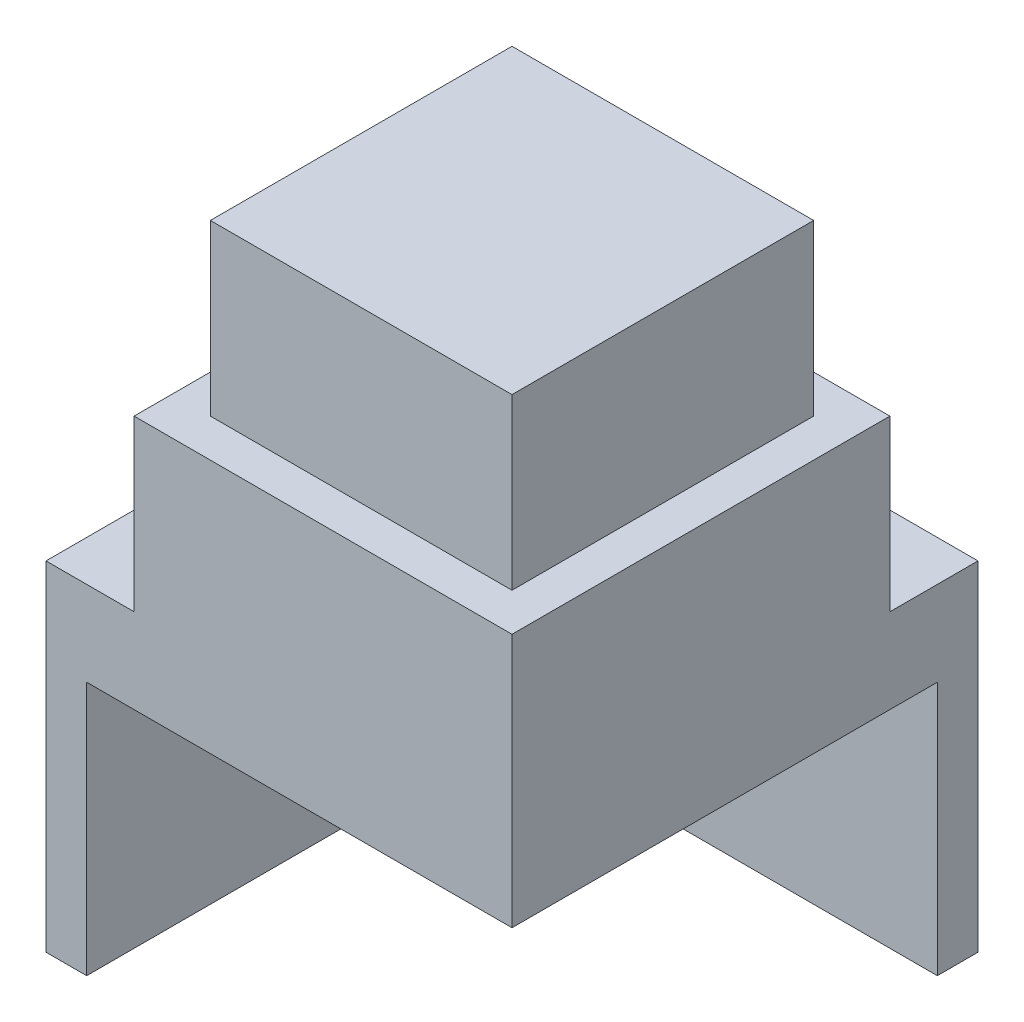
ISO-10303-21;
HEADER;
FILE_DESCRIPTION(('STEP AP214'),'2;1');
FILE_NAME('part.step','',(''),(''),'','','');
FILE_SCHEMA(('AUTOMOTIVE_DESIGN { 1 0 10303 214 1 1 1 1 }'));
ENDSEC;
DATA;
#1=APPLICATION_CONTEXT('core data for automotive mechanical design processes');
#2=APPLICATION_PROTOCOL_DEFINITION('international standard','automotive_design',2000,#1);
#3=PRODUCT_CONTEXT('',#1,'mechanical');
#4=PRODUCT('Part','Part','',(#3));
#5=PRODUCT_RELATED_PRODUCT_CATEGORY('part','',(#4));
#6=PRODUCT_DEFINITION_FORMATION('','',#4);
#7=PRODUCT_DEFINITION_CONTEXT('part definition',#1,'design');
#8=PRODUCT_DEFINITION('design','',#6,#7);
#9=PRODUCT_DEFINITION_SHAPE('','',#8);
#10=(LENGTH_UNIT() NAMED_UNIT(*) SI_UNIT(.MILLI.,.METRE.));
#11=(NAMED_UNIT(*) PLANE_ANGLE_UNIT() SI_UNIT($,.RADIAN.));
#12=(NAMED_UNIT(*) SI_UNIT($,.STERADIAN.) SOLID_ANGLE_UNIT());
#13=UNCERTAINTY_MEASURE_WITH_UNIT(LENGTH_MEASURE(1.E-05),#10,'distance_accuracy_value','');
#14=(GEOMETRIC_REPRESENTATION_CONTEXT(3) GLOBAL_UNCERTAINTY_ASSIGNED_CONTEXT((#13)) GLOBAL_UNIT_ASSIGNED_CONTEXT((#10,
#11,#12)) REPRESENTATION_CONTEXT('',''));
#15=CARTESIAN_POINT('',(0.,0.,0.));
#16=DIRECTION('',(0.,0.,1.));
#17=DIRECTION('',(1.,0.,0.));
#18=AXIS2_PLACEMENT_3D('',#15,#16,#17);
#19=CARTESIAN_POINT('',(13.75,15.,-13.75));
#20=DIRECTION('',(-1.,0.,0.));
#21=DIRECTION('',(0.,0.,1.));
#22=AXIS2_PLACEMENT_3D('',#19,#20,#21);
#23=PLANE('',#22);
#24=DIRECTION('',(0.,1.,0.));
#25=VECTOR('',#24,1.);
#26=CARTESIAN_POINT('',(13.75,5.,-8.55000000000001));
#27=LINE('',#26,#25);
#28=CARTESIAN_POINT('',(13.75,5.,-8.55000000000001));
#29=VERTEX_POINT('',#28);
#30=CARTESIAN_POINT('',(13.75,15.,-8.55000000000001));
#31=VERTEX_POINT('',#30);
#32=EDGE_CURVE('E228',#29,#31,#27,.T.);
#33=ORIENTED_EDGE('',*,*,#32,.T.);
#34=DIRECTION('',(0.,0.,-1.));
#35=VECTOR('',#34,1.);
#36=CARTESIAN_POINT('',(13.75,15.,-13.75));
#37=LINE('',#36,#35);
#38=CARTESIAN_POINT('',(13.75,15.,13.75));
#39=VERTEX_POINT('',#38);
#40=EDGE_CURVE('E235',#39,#31,#37,.T.);
#41=ORIENTED_EDGE('',*,*,#40,.F.);
#42=DIRECTION('',(0.,-1.,0.));
#43=VECTOR('',#42,1.);
#44=CARTESIAN_POINT('',(13.75,15.,13.75));
#45=LINE('',#44,#43);
#46=CARTESIAN_POINT('',(13.75,0.,13.75));
#47=VERTEX_POINT('',#46);
#48=EDGE_CURVE('E240',#39,#47,#45,.T.);
#49=ORIENTED_EDGE('',*,*,#48,.T.);
#50=DIRECTION('',(0.,0.,-1.));
#51=VECTOR('',#50,1.);
#52=CARTESIAN_POINT('',(13.75,0.,-13.75));
#53=LINE('',#52,#51);
#54=CARTESIAN_POINT('',(13.75,0.,-11.35));
#55=VERTEX_POINT('',#54);
#56=EDGE_CURVE('E231',#47,#55,#53,.T.);
#57=ORIENTED_EDGE('',*,*,#56,.T.);
#58=DIRECTION('',(0.,1.,0.));
#59=VECTOR('',#58,1.);
#60=CARTESIAN_POINT('',(13.75,-15.,-11.35));
#61=LINE('',#60,#59);
#62=CARTESIAN_POINT('',(13.75,-15.,-11.35));
#63=VERTEX_POINT('',#62);
#64=EDGE_CURVE('E142',#63,#55,#61,.T.);
#65=ORIENTED_EDGE('',*,*,#64,.F.);
#66=DIRECTION('',(0.,0.,1.));
#67=VECTOR('',#66,1.);
#68=CARTESIAN_POINT('',(13.75,-15.,0.));
#69=LINE('',#68,#67);
#70=CARTESIAN_POINT('',(13.75,-15.,-13.75));
#71=VERTEX_POINT('',#70);
#72=EDGE_CURVE('E167',#71,#63,#69,.T.);
#73=ORIENTED_EDGE('',*,*,#72,.F.);
#74=DIRECTION('',(0.,-1.,0.));
#75=VECTOR('',#74,1.);
#76=CARTESIAN_POINT('',(13.75,15.,-13.75));
#77=LINE('',#76,#75);
#78=CARTESIAN_POINT('',(13.75,5.,-13.75));
#79=VERTEX_POINT('',#78);
#80=EDGE_CURVE('E11',#79,#71,#77,.T.);
#81=ORIENTED_EDGE('',*,*,#80,.F.);
#82=DIRECTION('',(0.,0.,-1.));
#83=VECTOR('',#82,1.);
#84=CARTESIAN_POINT('',(13.75,5.,0.));
#85=LINE('',#84,#83);
#86=EDGE_CURVE('E217',#29,#79,#85,.T.);
#87=ORIENTED_EDGE('',*,*,#86,.F.);
#88=EDGE_LOOP('',(#33,#41,#49,#57,#65,#73,#81,#87));
#89=FACE_BOUND('',#88,.T.);
#90=ADVANCED_FACE('F35',(#89),#23,.F.);
#91=CARTESIAN_POINT('',(-13.75,15.,-13.75));
#92=DIRECTION('',(0.,0.,1.));
#93=DIRECTION('',(1.,0.,0.));
#94=AXIS2_PLACEMENT_3D('',#91,#92,#93);
#95=PLANE('',#94);
#96=DIRECTION('',(-1.,0.,0.));
#97=VECTOR('',#96,1.);
#98=CARTESIAN_POINT('',(0.,5.,-13.75));
#99=LINE('',#98,#97);
#100=CARTESIAN_POINT('',(-13.75,5.,-13.75));
#101=VERTEX_POINT('',#100);
#102=EDGE_CURVE('E219',#79,#101,#99,.T.);
#103=ORIENTED_EDGE('',*,*,#102,.F.);
#104=ORIENTED_EDGE('',*,*,#80,.T.);
#105=DIRECTION('',(1.,0.,0.));
#106=VECTOR('',#105,1.);
#107=CARTESIAN_POINT('',(0.,-15.,-13.75));
#108=LINE('',#107,#106);
#109=CARTESIAN_POINT('',(-13.75,-15.,-13.75));
#110=VERTEX_POINT('',#109);
#111=EDGE_CURVE('E164',#110,#71,#108,.T.);
#112=ORIENTED_EDGE('',*,*,#111,.F.);
#113=DIRECTION('',(0.,-1.,0.));
#114=VECTOR('',#113,1.);
#115=CARTESIAN_POINT('',(-13.75,15.,-13.75));
#116=LINE('',#115,#114);
#117=EDGE_CURVE('E42',#101,#110,#116,.T.);
#118=ORIENTED_EDGE('',*,*,#117,.F.);
#119=EDGE_LOOP('',(#103,#104,#112,#118));
#120=FACE_BOUND('',#119,.T.);
#121=ADVANCED_FACE('F253',(#120),#95,.F.);
#122=CARTESIAN_POINT('',(-13.75,15.,-13.75));
#123=DIRECTION('',(1.,0.,0.));
#124=DIRECTION('',(0.,0.,-1.));
#125=AXIS2_PLACEMENT_3D('',#122,#123,#124);
#126=PLANE('',#125);
#127=DIRECTION('',(0.,0.,1.));
#128=VECTOR('',#127,1.);
#129=CARTESIAN_POINT('',(-13.75,5.,0.));
#130=LINE('',#129,#128);
#131=CARTESIAN_POINT('',(-13.75,5.,13.75));
#132=VERTEX_POINT('',#131);
#133=EDGE_CURVE('E221',#101,#132,#130,.T.);
#134=ORIENTED_EDGE('',*,*,#133,.F.);
#135=ORIENTED_EDGE('',*,*,#117,.T.);
#136=DIRECTION('',(0.,0.,-1.));
#137=VECTOR('',#136,1.);
#138=CARTESIAN_POINT('',(-13.75,-15.,0.));
#139=LINE('',#138,#137);
#140=CARTESIAN_POINT('',(-13.75,-15.,13.75));
#141=VERTEX_POINT('',#140);
#142=EDGE_CURVE('E154',#141,#110,#139,.T.);
#143=ORIENTED_EDGE('',*,*,#142,.F.);
#144=DIRECTION('',(0.,-1.,0.));
#145=VECTOR('',#144,1.);
#146=CARTESIAN_POINT('',(-13.75,15.,13.75));
#147=LINE('',#146,#145);
#148=EDGE_CURVE('E150',#132,#141,#147,.T.);
#149=ORIENTED_EDGE('',*,*,#148,.F.);
#150=EDGE_LOOP('',(#134,#135,#143,#149));
#151=FACE_BOUND('',#150,.T.);
#152=ADVANCED_FACE('F248',(#151),#126,.F.);
#153=CARTESIAN_POINT('',(0.,15.,0.));
#154=DIRECTION('',(0.,1.,0.));
#155=DIRECTION('',(0.,0.,1.));
#156=AXIS2_PLACEMENT_3D('',#153,#154,#155);
#157=PLANE('',#156);
#158=DIRECTION('',(0.,0.,-1.));
#159=VECTOR('',#158,1.);
#160=CARTESIAN_POINT('',(11.5,15.,-6.30000000000001));
#161=LINE('',#160,#159);
#162=CARTESIAN_POINT('',(11.5,15.,11.5));
#163=VERTEX_POINT('',#162);
#164=CARTESIAN_POINT('',(11.5,15.,-6.30000000000001));
#165=VERTEX_POINT('',#164);
#166=EDGE_CURVE('E141',#163,#165,#161,.T.);
#167=ORIENTED_EDGE('',*,*,#166,.F.);
#168=DIRECTION('',(1.,0.,0.));
#169=VECTOR('',#168,1.);
#170=CARTESIAN_POINT('',(-6.29999999999999,15.,11.5));
#171=LINE('',#170,#169);
#172=CARTESIAN_POINT('',(-6.29999999999999,15.,11.5));
#173=VERTEX_POINT('',#172);
#174=EDGE_CURVE('E179',#173,#163,#171,.T.);
#175=ORIENTED_EDGE('',*,*,#174,.F.);
#176=DIRECTION('',(0.,0.,1.));
#177=VECTOR('',#176,1.);
#178=CARTESIAN_POINT('',(-6.3,15.,-6.30000000000001));
#179=LINE('',#178,#177);
#180=CARTESIAN_POINT('',(-6.3,15.,-6.30000000000001));
#181=VERTEX_POINT('',#180);
#182=EDGE_CURVE('E191',#181,#173,#179,.T.);
#183=ORIENTED_EDGE('',*,*,#182,.F.);
#184=DIRECTION('',(-1.,0.,0.));
#185=VECTOR('',#184,1.);
#186=CARTESIAN_POINT('',(-6.3,15.,-6.30000000000001));
#187=LINE('',#186,#185);
#188=EDGE_CURVE('E188',#165,#181,#187,.T.);
#189=ORIENTED_EDGE('',*,*,#188,.F.);
#190=EDGE_LOOP('',(#167,#175,#183,#189));
#191=FACE_BOUND('',#190,.T.);
#192=ORIENTED_EDGE('',*,*,#40,.T.);
#193=DIRECTION('',(-1.,0.,0.));
#194=VECTOR('',#193,1.);
#195=CARTESIAN_POINT('',(0.,15.,-8.55));
#196=LINE('',#195,#194);
#197=CARTESIAN_POINT('',(-8.55,15.,-8.55));
#198=VERTEX_POINT('',#197);
#199=EDGE_CURVE('E212',#31,#198,#196,.T.);
#200=ORIENTED_EDGE('',*,*,#199,.T.);
#201=DIRECTION('',(0.,0.,-1.));
#202=VECTOR('',#201,1.);
#203=CARTESIAN_POINT('',(-8.55,15.,0.));
#204=LINE('',#203,#202);
#205=CARTESIAN_POINT('',(-8.55,15.,13.75));
#206=VERTEX_POINT('',#205);
#207=EDGE_CURVE('E207',#206,#198,#204,.T.);
#208=ORIENTED_EDGE('',*,*,#207,.F.);
#209=DIRECTION('',(1.,0.,0.));
#210=VECTOR('',#209,1.);
#211=CARTESIAN_POINT('',(-13.75,15.,13.75));
#212=LINE('',#211,#210);
#213=EDGE_CURVE('E238',#206,#39,#212,.T.);
#214=ORIENTED_EDGE('',*,*,#213,.T.);
#215=EDGE_LOOP('',(#192,#200,#208,#214));
#216=FACE_BOUND('',#215,.T.);
#217=ADVANCED_FACE('F276',(#191,#216),#157,.T.);
#218=CARTESIAN_POINT('',(-13.75,15.,13.75));
#219=DIRECTION('',(0.,0.,-1.));
#220=DIRECTION('',(-1.,0.,0.));
#221=AXIS2_PLACEMENT_3D('',#218,#219,#220);
#222=PLANE('',#221);
#223=ORIENTED_EDGE('',*,*,#213,.F.);
#224=DIRECTION('',(0.,1.,0.));
#225=VECTOR('',#224,1.);
#226=CARTESIAN_POINT('',(-8.55,5.,13.75));
#227=LINE('',#226,#225);
#228=CARTESIAN_POINT('',(-8.55,5.,13.75));
#229=VERTEX_POINT('',#228);
#230=EDGE_CURVE('E223',#229,#206,#227,.T.);
#231=ORIENTED_EDGE('',*,*,#230,.F.);
#232=DIRECTION('',(1.,0.,0.));
#233=VECTOR('',#232,1.);
#234=CARTESIAN_POINT('',(0.,5.,13.75));
#235=LINE('',#234,#233);
#236=EDGE_CURVE('E208',#132,#229,#235,.T.);
#237=ORIENTED_EDGE('',*,*,#236,.F.);
#238=ORIENTED_EDGE('',*,*,#148,.T.);
#239=DIRECTION('',(-1.,0.,0.));
#240=VECTOR('',#239,1.);
#241=CARTESIAN_POINT('',(0.,-15.,13.75));
#242=LINE('',#241,#240);
#243=CARTESIAN_POINT('',(-11.35,-15.,13.75));
#244=VERTEX_POINT('',#243);
#245=EDGE_CURVE('E145',#244,#141,#242,.T.);
#246=ORIENTED_EDGE('',*,*,#245,.F.);
#247=DIRECTION('',(0.,1.,0.));
#248=VECTOR('',#247,1.);
#249=CARTESIAN_POINT('',(-11.35,-15.,13.75));
#250=LINE('',#249,#248);
#251=CARTESIAN_POINT('',(-11.35,0.,13.75));
#252=VERTEX_POINT('',#251);
#253=EDGE_CURVE('E133',#244,#252,#250,.T.);
#254=ORIENTED_EDGE('',*,*,#253,.T.);
#255=DIRECTION('',(1.,0.,0.));
#256=VECTOR('',#255,1.);
#257=CARTESIAN_POINT('',(-13.75,0.,13.75));
#258=LINE('',#257,#256);
#259=EDGE_CURVE('E49',#252,#47,#258,.T.);
#260=ORIENTED_EDGE('',*,*,#259,.T.);
#261=ORIENTED_EDGE('',*,*,#48,.F.);
#262=EDGE_LOOP('',(#223,#231,#237,#238,#246,#254,#260,#261));
#263=FACE_BOUND('',#262,.T.);
#264=ADVANCED_FACE('F147',(#263),#222,.F.);
#265=CARTESIAN_POINT('',(0.,0.,0.));
#266=DIRECTION('',(0.,1.,0.));
#267=DIRECTION('',(0.,0.,1.));
#268=AXIS2_PLACEMENT_3D('',#265,#266,#267);
#269=PLANE('',#268);
#270=ORIENTED_EDGE('',*,*,#259,.F.);
#271=DIRECTION('',(0.,0.,-1.));
#272=VECTOR('',#271,1.);
#273=CARTESIAN_POINT('',(-11.35,0.,0.));
#274=LINE('',#273,#272);
#275=CARTESIAN_POINT('',(-11.35,0.,-11.35));
#276=VERTEX_POINT('',#275);
#277=EDGE_CURVE('E139',#252,#276,#274,.T.);
#278=ORIENTED_EDGE('',*,*,#277,.T.);
#279=DIRECTION('',(-1.,0.,0.));
#280=VECTOR('',#279,1.);
#281=CARTESIAN_POINT('',(0.,0.,-11.35));
#282=LINE('',#281,#280);
#283=EDGE_CURVE('E54',#55,#276,#282,.T.);
#284=ORIENTED_EDGE('',*,*,#283,.F.);
#285=ORIENTED_EDGE('',*,*,#56,.F.);
#286=EDGE_LOOP('',(#270,#278,#284,#285));
#287=FACE_BOUND('',#286,.T.);
#288=ADVANCED_FACE('F281',(#287),#269,.F.);
#289=CARTESIAN_POINT('',(0.,5.,-8.55));
#290=DIRECTION('',(0.,0.,-1.));
#291=DIRECTION('',(-1.,0.,0.));
#292=AXIS2_PLACEMENT_3D('',#289,#290,#291);
#293=PLANE('',#292);
#294=ORIENTED_EDGE('',*,*,#199,.F.);
#295=ORIENTED_EDGE('',*,*,#32,.F.);
#296=DIRECTION('',(-1.,0.,0.));
#297=VECTOR('',#296,1.);
#298=CARTESIAN_POINT('',(0.,5.,-8.55));
#299=LINE('',#298,#297);
#300=CARTESIAN_POINT('',(-8.55,5.,-8.55));
#301=VERTEX_POINT('',#300);
#302=EDGE_CURVE('E215',#29,#301,#299,.T.);
#303=ORIENTED_EDGE('',*,*,#302,.T.);
#304=DIRECTION('',(0.,1.,0.));
#305=VECTOR('',#304,1.);
#306=CARTESIAN_POINT('',(-8.55,5.,-8.55));
#307=LINE('',#306,#305);
#308=EDGE_CURVE('E232',#301,#198,#307,.T.);
#309=ORIENTED_EDGE('',*,*,#308,.T.);
#310=EDGE_LOOP('',(#294,#295,#303,#309));
#311=FACE_BOUND('',#310,.T.);
#312=ADVANCED_FACE('F284',(#311),#293,.T.);
#313=CARTESIAN_POINT('',(-8.55,5.,0.));
#314=DIRECTION('',(1.,0.,0.));
#315=DIRECTION('',(0.,0.,-1.));
#316=AXIS2_PLACEMENT_3D('',#313,#314,#315);
#317=PLANE('',#316);
#318=ORIENTED_EDGE('',*,*,#207,.T.);
#319=ORIENTED_EDGE('',*,*,#308,.F.);
#320=DIRECTION('',(0.,0.,-1.));
#321=VECTOR('',#320,1.);
#322=CARTESIAN_POINT('',(-8.55,5.,0.));
#323=LINE('',#322,#321);
#324=EDGE_CURVE('E211',#229,#301,#323,.T.);
#325=ORIENTED_EDGE('',*,*,#324,.F.);
#326=ORIENTED_EDGE('',*,*,#230,.T.);
#327=EDGE_LOOP('',(#318,#319,#325,#326));
#328=FACE_BOUND('',#327,.T.);
#329=ADVANCED_FACE('F288',(#328),#317,.F.);
#330=CARTESIAN_POINT('',(0.,5.,0.));
#331=DIRECTION('',(0.,1.,0.));
#332=DIRECTION('',(0.,0.,1.));
#333=AXIS2_PLACEMENT_3D('',#330,#331,#332);
#334=PLANE('',#333);
#335=ORIENTED_EDGE('',*,*,#236,.T.);
#336=ORIENTED_EDGE('',*,*,#324,.T.);
#337=ORIENTED_EDGE('',*,*,#302,.F.);
#338=ORIENTED_EDGE('',*,*,#86,.T.);
#339=ORIENTED_EDGE('',*,*,#102,.T.);
#340=ORIENTED_EDGE('',*,*,#133,.T.);
#341=EDGE_LOOP('',(#335,#336,#337,#338,#339,#340));
#342=FACE_BOUND('',#341,.T.);
#343=ADVANCED_FACE('F291',(#342),#334,.T.);
#344=CARTESIAN_POINT('',(11.5,25.,-6.30000000000001));
#345=DIRECTION('',(-1.,0.,0.));
#346=DIRECTION('',(0.,0.,1.));
#347=AXIS2_PLACEMENT_3D('',#344,#345,#346);
#348=PLANE('',#347);
#349=ORIENTED_EDGE('',*,*,#166,.T.);
#350=DIRECTION('',(0.,-1.,0.));
#351=VECTOR('',#350,1.);
#352=CARTESIAN_POINT('',(11.5,25.,-6.30000000000001));
#353=LINE('',#352,#351);
#354=CARTESIAN_POINT('',(11.5,25.,-6.30000000000001));
#355=VERTEX_POINT('',#354);
#356=EDGE_CURVE('E204',#355,#165,#353,.T.);
#357=ORIENTED_EDGE('',*,*,#356,.F.);
#358=DIRECTION('',(0.,0.,-1.));
#359=VECTOR('',#358,1.);
#360=CARTESIAN_POINT('',(11.5,25.,-6.30000000000001));
#361=LINE('',#360,#359);
#362=CARTESIAN_POINT('',(11.5,25.,11.5));
#363=VERTEX_POINT('',#362);
#364=EDGE_CURVE('E175',#363,#355,#361,.T.);
#365=ORIENTED_EDGE('',*,*,#364,.F.);
#366=DIRECTION('',(0.,-1.,0.));
#367=VECTOR('',#366,1.);
#368=CARTESIAN_POINT('',(11.5,25.,11.5));
#369=LINE('',#368,#367);
#370=EDGE_CURVE('E185',#363,#163,#369,.T.);
#371=ORIENTED_EDGE('',*,*,#370,.T.);
#372=EDGE_LOOP('',(#349,#357,#365,#371));
#373=FACE_BOUND('',#372,.T.);
#374=ADVANCED_FACE('F298',(#373),#348,.F.);
#375=CARTESIAN_POINT('',(-6.3,25.,-6.30000000000001));
#376=DIRECTION('',(0.,0.,1.));
#377=DIRECTION('',(1.,0.,0.));
#378=AXIS2_PLACEMENT_3D('',#375,#376,#377);
#379=PLANE('',#378);
#380=ORIENTED_EDGE('',*,*,#188,.T.);
#381=DIRECTION('',(0.,-1.,0.));
#382=VECTOR('',#381,1.);
#383=CARTESIAN_POINT('',(-6.3,25.,-6.30000000000001));
#384=LINE('',#383,#382);
#385=CARTESIAN_POINT('',(-6.3,25.,-6.30000000000001));
#386=VERTEX_POINT('',#385);
#387=EDGE_CURVE('E201',#386,#181,#384,.T.);
#388=ORIENTED_EDGE('',*,*,#387,.F.);
#389=DIRECTION('',(-1.,0.,0.));
#390=VECTOR('',#389,1.);
#391=CARTESIAN_POINT('',(-6.3,25.,-6.30000000000001));
#392=LINE('',#391,#390);
#393=EDGE_CURVE('E178',#355,#386,#392,.T.);
#394=ORIENTED_EDGE('',*,*,#393,.F.);
#395=ORIENTED_EDGE('',*,*,#356,.T.);
#396=EDGE_LOOP('',(#380,#388,#394,#395));
#397=FACE_BOUND('',#396,.T.);
#398=ADVANCED_FACE('F302',(#397),#379,.F.);
#399=CARTESIAN_POINT('',(-6.3,25.,-6.30000000000001));
#400=DIRECTION('',(1.,0.,0.));
#401=DIRECTION('',(0.,0.,-1.));
#402=AXIS2_PLACEMENT_3D('',#399,#400,#401);
#403=PLANE('',#402);
#404=ORIENTED_EDGE('',*,*,#182,.T.);
#405=DIRECTION('',(0.,-1.,0.));
#406=VECTOR('',#405,1.);
#407=CARTESIAN_POINT('',(-6.29999999999999,25.,11.5));
#408=LINE('',#407,#406);
#409=CARTESIAN_POINT('',(-6.29999999999999,25.,11.5));
#410=VERTEX_POINT('',#409);
#411=EDGE_CURVE('E198',#410,#173,#408,.T.);
#412=ORIENTED_EDGE('',*,*,#411,.F.);
#413=DIRECTION('',(0.,0.,1.));
#414=VECTOR('',#413,1.);
#415=CARTESIAN_POINT('',(-6.3,25.,-6.30000000000001));
#416=LINE('',#415,#414);
#417=EDGE_CURVE('E181',#386,#410,#416,.T.);
#418=ORIENTED_EDGE('',*,*,#417,.F.);
#419=ORIENTED_EDGE('',*,*,#387,.T.);
#420=EDGE_LOOP('',(#404,#412,#418,#419));
#421=FACE_BOUND('',#420,.T.);
#422=ADVANCED_FACE('F306',(#421),#403,.F.);
#423=CARTESIAN_POINT('',(-6.29999999999999,25.,11.5));
#424=DIRECTION('',(0.,0.,-1.));
#425=DIRECTION('',(-1.,0.,0.));
#426=AXIS2_PLACEMENT_3D('',#423,#424,#425);
#427=PLANE('',#426);
#428=ORIENTED_EDGE('',*,*,#174,.T.);
#429=ORIENTED_EDGE('',*,*,#370,.F.);
#430=DIRECTION('',(1.,0.,0.));
#431=VECTOR('',#430,1.);
#432=CARTESIAN_POINT('',(-6.29999999999999,25.,11.5));
#433=LINE('',#432,#431);
#434=EDGE_CURVE('E183',#410,#363,#433,.T.);
#435=ORIENTED_EDGE('',*,*,#434,.F.);
#436=ORIENTED_EDGE('',*,*,#411,.T.);
#437=EDGE_LOOP('',(#428,#429,#435,#436));
#438=FACE_BOUND('',#437,.T.);
#439=ADVANCED_FACE('F310',(#438),#427,.F.);
#440=CARTESIAN_POINT('',(0.,25.,0.));
#441=DIRECTION('',(0.,1.,0.));
#442=DIRECTION('',(0.,0.,1.));
#443=AXIS2_PLACEMENT_3D('',#440,#441,#442);
#444=PLANE('',#443);
#445=ORIENTED_EDGE('',*,*,#364,.T.);
#446=ORIENTED_EDGE('',*,*,#393,.T.);
#447=ORIENTED_EDGE('',*,*,#417,.T.);
#448=ORIENTED_EDGE('',*,*,#434,.T.);
#449=EDGE_LOOP('',(#445,#446,#447,#448));
#450=FACE_BOUND('',#449,.T.);
#451=ADVANCED_FACE('F267',(#450),#444,.T.);
#452=CARTESIAN_POINT('',(-11.35,-15.,0.));
#453=DIRECTION('',(1.,0.,0.));
#454=DIRECTION('',(0.,0.,-1.));
#455=AXIS2_PLACEMENT_3D('',#452,#453,#454);
#456=PLANE('',#455);
#457=ORIENTED_EDGE('',*,*,#277,.F.);
#458=ORIENTED_EDGE('',*,*,#253,.F.);
#459=DIRECTION('',(0.,0.,-1.));
#460=VECTOR('',#459,1.);
#461=CARTESIAN_POINT('',(-11.35,-15.,0.));
#462=LINE('',#461,#460);
#463=CARTESIAN_POINT('',(-11.35,-15.,-11.35));
#464=VERTEX_POINT('',#463);
#465=EDGE_CURVE('E138',#244,#464,#462,.T.);
#466=ORIENTED_EDGE('',*,*,#465,.T.);
#467=DIRECTION('',(0.,1.,0.));
#468=VECTOR('',#467,1.);
#469=CARTESIAN_POINT('',(-11.35,-15.,-11.35));
#470=LINE('',#469,#468);
#471=EDGE_CURVE('E170',#464,#276,#470,.T.);
#472=ORIENTED_EDGE('',*,*,#471,.T.);
#473=EDGE_LOOP('',(#457,#458,#466,#472));
#474=FACE_BOUND('',#473,.T.);
#475=ADVANCED_FACE('F135',(#474),#456,.T.);
#476=CARTESIAN_POINT('',(0.,-15.,-11.35));
#477=DIRECTION('',(0.,0.,-1.));
#478=DIRECTION('',(-1.,0.,0.));
#479=AXIS2_PLACEMENT_3D('',#476,#477,#478);
#480=PLANE('',#479);
#481=ORIENTED_EDGE('',*,*,#283,.T.);
#482=ORIENTED_EDGE('',*,*,#471,.F.);
#483=DIRECTION('',(-1.,0.,0.));
#484=VECTOR('',#483,1.);
#485=CARTESIAN_POINT('',(0.,-15.,-11.35));
#486=LINE('',#485,#484);
#487=EDGE_CURVE('E158',#63,#464,#486,.T.);
#488=ORIENTED_EDGE('',*,*,#487,.F.);
#489=ORIENTED_EDGE('',*,*,#64,.T.);
#490=EDGE_LOOP('',(#481,#482,#488,#489));
#491=FACE_BOUND('',#490,.T.);
#492=ADVANCED_FACE('F259',(#491),#480,.F.);
#493=CARTESIAN_POINT('',(0.,-15.,0.));
#494=DIRECTION('',(0.,-1.,0.));
#495=DIRECTION('',(0.,0.,-1.));
#496=AXIS2_PLACEMENT_3D('',#493,#494,#495);
#497=PLANE('',#496);
#498=ORIENTED_EDGE('',*,*,#465,.F.);
#499=ORIENTED_EDGE('',*,*,#245,.T.);
#500=ORIENTED_EDGE('',*,*,#142,.T.);
#501=ORIENTED_EDGE('',*,*,#111,.T.);
#502=ORIENTED_EDGE('',*,*,#72,.T.);
#503=ORIENTED_EDGE('',*,*,#487,.T.);
#504=EDGE_LOOP('',(#498,#499,#500,#501,#502,#503));
#505=FACE_BOUND('',#504,.T.);
#506=ADVANCED_FACE('F156',(#505),#497,.T.);
#507=CLOSED_SHELL('',(#90,#121,#152,#217,#264,#288,#312,#329,#343,#374,#398,#422,#439,#451,#475,
#492,#506));
#508=MANIFOLD_SOLID_BREP('B2',#507);
#509=ADVANCED_BREP_SHAPE_REPRESENTATION('',(#18,#508),#14);
#510=SHAPE_DEFINITION_REPRESENTATION(#9,#509);
ENDSEC;
END-ISO-10303-21;
